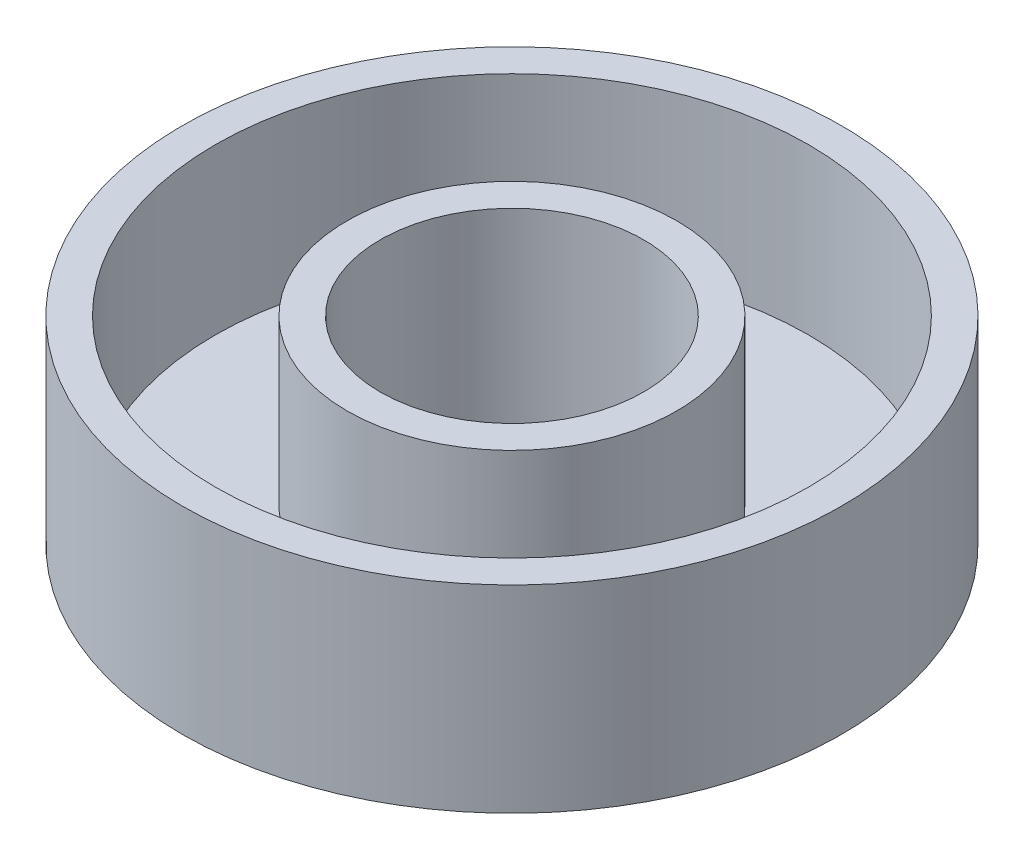
ISO-10303-21;
HEADER;
FILE_DESCRIPTION(('STEP AP214'),'2;1');
FILE_NAME('part.step','',(''),(''),'','','');
FILE_SCHEMA(('AUTOMOTIVE_DESIGN { 1 0 10303 214 1 1 1 1 }'));
ENDSEC;
DATA;
#1=APPLICATION_CONTEXT('core data for automotive mechanical design processes');
#2=APPLICATION_PROTOCOL_DEFINITION('international standard','automotive_design',2000,#1);
#3=PRODUCT_CONTEXT('',#1,'mechanical');
#4=PRODUCT('Part','Part','',(#3));
#5=PRODUCT_RELATED_PRODUCT_CATEGORY('part','',(#4));
#6=PRODUCT_DEFINITION_FORMATION('','',#4);
#7=PRODUCT_DEFINITION_CONTEXT('part definition',#1,'design');
#8=PRODUCT_DEFINITION('design','',#6,#7);
#9=PRODUCT_DEFINITION_SHAPE('','',#8);
#10=(LENGTH_UNIT() NAMED_UNIT(*) SI_UNIT(.MILLI.,.METRE.));
#11=(NAMED_UNIT(*) PLANE_ANGLE_UNIT() SI_UNIT($,.RADIAN.));
#12=(NAMED_UNIT(*) SI_UNIT($,.STERADIAN.) SOLID_ANGLE_UNIT());
#13=UNCERTAINTY_MEASURE_WITH_UNIT(LENGTH_MEASURE(1.E-05),#10,'distance_accuracy_value','');
#14=(GEOMETRIC_REPRESENTATION_CONTEXT(3) GLOBAL_UNCERTAINTY_ASSIGNED_CONTEXT((#13)) GLOBAL_UNIT_ASSIGNED_CONTEXT((#10,
#11,#12)) REPRESENTATION_CONTEXT('',''));
#15=CARTESIAN_POINT('',(0.,0.,0.));
#16=DIRECTION('',(0.,0.,1.));
#17=DIRECTION('',(1.,0.,0.));
#18=AXIS2_PLACEMENT_3D('',#15,#16,#17);
#19=CARTESIAN_POINT('',(0.,6.,0.));
#20=DIRECTION('',(0.,1.,0.));
#21=DIRECTION('',(0.,0.,1.));
#22=AXIS2_PLACEMENT_3D('',#19,#20,#21);
#23=PLANE('',#22);
#24=CARTESIAN_POINT('',(0.,6.,0.));
#25=DIRECTION('',(0.,1.,0.));
#26=DIRECTION('',(0.,0.,1.));
#27=AXIS2_PLACEMENT_3D('',#24,#25,#26);
#28=CIRCLE('',#27,4.);
#29=CARTESIAN_POINT('',(0.,6.,4.));
#30=VERTEX_POINT('',#29);
#31=EDGE_CURVE('E47',#30,#30,#28,.T.);
#32=ORIENTED_EDGE('',*,*,#31,.F.);
#33=EDGE_LOOP('',(#32));
#34=FACE_BOUND('',#33,.T.);
#35=CARTESIAN_POINT('',(0.,6.,0.));
#36=DIRECTION('',(0.,1.,0.));
#37=DIRECTION('',(0.,0.,1.));
#38=AXIS2_PLACEMENT_3D('',#35,#36,#37);
#39=CIRCLE('',#38,5.);
#40=CARTESIAN_POINT('',(0.,6.,5.));
#41=VERTEX_POINT('',#40);
#42=EDGE_CURVE('E57',#41,#41,#39,.T.);
#43=ORIENTED_EDGE('',*,*,#42,.T.);
#44=EDGE_LOOP('',(#43));
#45=FACE_BOUND('',#44,.T.);
#46=ADVANCED_FACE('F33',(#34,#45),#23,.T.);
#47=CARTESIAN_POINT('',(0.,6.,0.));
#48=DIRECTION('',(0.,-1.,0.));
#49=DIRECTION('',(0.,0.,-1.));
#50=AXIS2_PLACEMENT_3D('',#47,#48,#49);
#51=CYLINDRICAL_SURFACE('',#50,10.);
#52=CARTESIAN_POINT('',(0.,6.,0.));
#53=DIRECTION('',(0.,1.,0.));
#54=DIRECTION('',(0.,0.,1.));
#55=AXIS2_PLACEMENT_3D('',#52,#53,#54);
#56=CIRCLE('',#55,10.);
#57=CARTESIAN_POINT('',(0.,6.,10.));
#58=VERTEX_POINT('',#57);
#59=EDGE_CURVE('E10',#58,#58,#56,.T.);
#60=ORIENTED_EDGE('',*,*,#59,.F.);
#61=EDGE_LOOP('',(#60));
#62=FACE_BOUND('',#61,.T.);
#63=CARTESIAN_POINT('',(0.,0.,0.));
#64=DIRECTION('',(0.,1.,0.));
#65=DIRECTION('',(0.,0.,1.));
#66=AXIS2_PLACEMENT_3D('',#63,#64,#65);
#67=CIRCLE('',#66,10.);
#68=CARTESIAN_POINT('',(0.,0.,10.));
#69=VERTEX_POINT('',#68);
#70=EDGE_CURVE('E41',#69,#69,#67,.T.);
#71=ORIENTED_EDGE('',*,*,#70,.T.);
#72=EDGE_LOOP('',(#71));
#73=FACE_BOUND('',#72,.T.);
#74=ADVANCED_FACE('F35',(#62,#73),#51,.T.);
#75=CARTESIAN_POINT('',(0.,6.,0.));
#76=DIRECTION('',(0.,1.,0.));
#77=DIRECTION('',(0.,0.,1.));
#78=AXIS2_PLACEMENT_3D('',#75,#76,#77);
#79=CIRCLE('',#78,9.);
#80=CARTESIAN_POINT('',(0.,6.,9.));
#81=VERTEX_POINT('',#80);
#82=EDGE_CURVE('E51',#81,#81,#79,.T.);
#83=ORIENTED_EDGE('',*,*,#82,.F.);
#84=EDGE_LOOP('',(#83));
#85=FACE_BOUND('',#84,.T.);
#86=ORIENTED_EDGE('',*,*,#59,.T.);
#87=EDGE_LOOP('',(#86));
#88=FACE_BOUND('',#87,.T.);
#89=ADVANCED_FACE('F79',(#85,#88),#23,.T.);
#90=CARTESIAN_POINT('',(0.,0.,0.));
#91=DIRECTION('',(0.,1.,0.));
#92=DIRECTION('',(0.,0.,1.));
#93=AXIS2_PLACEMENT_3D('',#90,#91,#92);
#94=PLANE('',#93);
#95=CARTESIAN_POINT('',(0.,0.,0.));
#96=DIRECTION('',(0.,1.,0.));
#97=DIRECTION('',(0.,0.,1.));
#98=AXIS2_PLACEMENT_3D('',#95,#96,#97);
#99=CIRCLE('',#98,4.);
#100=CARTESIAN_POINT('',(0.,0.,4.));
#101=VERTEX_POINT('',#100);
#102=EDGE_CURVE('E37',#101,#101,#99,.T.);
#103=ORIENTED_EDGE('',*,*,#102,.T.);
#104=EDGE_LOOP('',(#103));
#105=FACE_BOUND('',#104,.T.);
#106=ORIENTED_EDGE('',*,*,#70,.F.);
#107=EDGE_LOOP('',(#106));
#108=FACE_BOUND('',#107,.T.);
#109=ADVANCED_FACE('F81',(#105,#108),#94,.F.);
#110=CARTESIAN_POINT('',(0.,-14.,0.));
#111=DIRECTION('',(0.,1.,0.));
#112=DIRECTION('',(0.,0.,1.));
#113=AXIS2_PLACEMENT_3D('',#110,#111,#112);
#114=CYLINDRICAL_SURFACE('',#113,4.);
#115=ORIENTED_EDGE('',*,*,#31,.T.);
#116=EDGE_LOOP('',(#115));
#117=FACE_BOUND('',#116,.T.);
#118=ORIENTED_EDGE('',*,*,#102,.F.);
#119=EDGE_LOOP('',(#118));
#120=FACE_BOUND('',#119,.T.);
#121=ADVANCED_FACE('F75',(#117,#120),#114,.F.);
#122=CARTESIAN_POINT('',(0.,1.,0.));
#123=DIRECTION('',(0.,1.,0.));
#124=DIRECTION('',(0.,0.,1.));
#125=AXIS2_PLACEMENT_3D('',#122,#123,#124);
#126=CYLINDRICAL_SURFACE('',#125,9.);
#127=CARTESIAN_POINT('',(0.,1.,0.));
#128=DIRECTION('',(0.,1.,0.));
#129=DIRECTION('',(0.,0.,1.));
#130=AXIS2_PLACEMENT_3D('',#127,#128,#129);
#131=CIRCLE('',#130,9.);
#132=CARTESIAN_POINT('',(0.,1.,9.));
#133=VERTEX_POINT('',#132);
#134=EDGE_CURVE('E50',#133,#133,#131,.T.);
#135=ORIENTED_EDGE('',*,*,#134,.F.);
#136=EDGE_LOOP('',(#135));
#137=FACE_BOUND('',#136,.T.);
#138=ORIENTED_EDGE('',*,*,#82,.T.);
#139=EDGE_LOOP('',(#138));
#140=FACE_BOUND('',#139,.T.);
#141=ADVANCED_FACE('F69',(#137,#140),#126,.F.);
#142=CARTESIAN_POINT('',(0.,1.,0.));
#143=DIRECTION('',(0.,1.,0.));
#144=DIRECTION('',(0.,0.,1.));
#145=AXIS2_PLACEMENT_3D('',#142,#143,#144);
#146=PLANE('',#145);
#147=CARTESIAN_POINT('',(0.,1.,0.));
#148=DIRECTION('',(0.,1.,0.));
#149=DIRECTION('',(0.,0.,1.));
#150=AXIS2_PLACEMENT_3D('',#147,#148,#149);
#151=CIRCLE('',#150,5.);
#152=CARTESIAN_POINT('',(0.,1.,5.));
#153=VERTEX_POINT('',#152);
#154=EDGE_CURVE('E54',#153,#153,#151,.T.);
#155=ORIENTED_EDGE('',*,*,#154,.F.);
#156=EDGE_LOOP('',(#155));
#157=FACE_BOUND('',#156,.T.);
#158=ORIENTED_EDGE('',*,*,#134,.T.);
#159=EDGE_LOOP('',(#158));
#160=FACE_BOUND('',#159,.T.);
#161=ADVANCED_FACE('F66',(#157,#160),#146,.T.);
#162=CARTESIAN_POINT('',(0.,1.,0.));
#163=DIRECTION('',(0.,1.,0.));
#164=DIRECTION('',(0.,0.,1.));
#165=AXIS2_PLACEMENT_3D('',#162,#163,#164);
#166=CYLINDRICAL_SURFACE('',#165,5.);
#167=ORIENTED_EDGE('',*,*,#154,.T.);
#168=EDGE_LOOP('',(#167));
#169=FACE_BOUND('',#168,.T.);
#170=ORIENTED_EDGE('',*,*,#42,.F.);
#171=EDGE_LOOP('',(#170));
#172=FACE_BOUND('',#171,.T.);
#173=ADVANCED_FACE('F63',(#169,#172),#166,.T.);
#174=CLOSED_SHELL('',(#46,#74,#89,#109,#121,#141,#161,#173));
#175=MANIFOLD_SOLID_BREP('B2',#174);
#176=ADVANCED_BREP_SHAPE_REPRESENTATION('',(#18,#175),#14);
#177=SHAPE_DEFINITION_REPRESENTATION(#9,#176);
ENDSEC;
END-ISO-10303-21;
